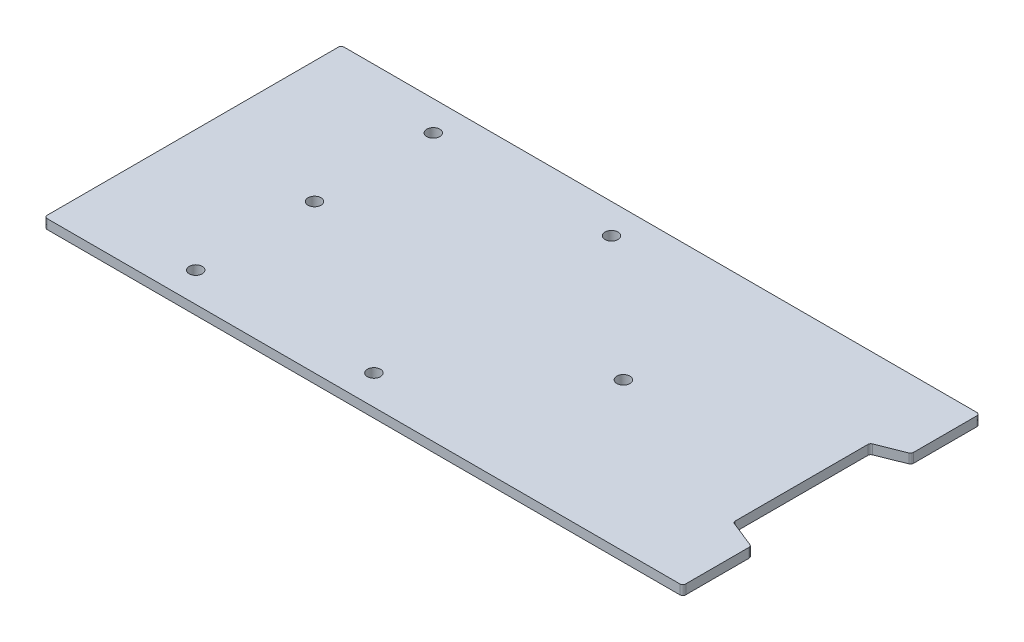
ISO-10303-21;
HEADER;
FILE_DESCRIPTION(('STEP AP214'),'2;1');
FILE_NAME('part.step','',(''),(''),'','','');
FILE_SCHEMA(('AUTOMOTIVE_DESIGN { 1 0 10303 214 1 1 1 1 }'));
ENDSEC;
DATA;
#1=APPLICATION_CONTEXT('core data for automotive mechanical design processes');
#2=APPLICATION_PROTOCOL_DEFINITION('international standard','automotive_design',2000,#1);
#3=PRODUCT_CONTEXT('',#1,'mechanical');
#4=PRODUCT('Part','Part','',(#3));
#5=PRODUCT_RELATED_PRODUCT_CATEGORY('part','',(#4));
#6=PRODUCT_DEFINITION_FORMATION('','',#4);
#7=PRODUCT_DEFINITION_CONTEXT('part definition',#1,'design');
#8=PRODUCT_DEFINITION('design','',#6,#7);
#9=PRODUCT_DEFINITION_SHAPE('','',#8);
#10=(LENGTH_UNIT() NAMED_UNIT(*) SI_UNIT(.MILLI.,.METRE.));
#11=(NAMED_UNIT(*) PLANE_ANGLE_UNIT() SI_UNIT($,.RADIAN.));
#12=(NAMED_UNIT(*) SI_UNIT($,.STERADIAN.) SOLID_ANGLE_UNIT());
#13=UNCERTAINTY_MEASURE_WITH_UNIT(LENGTH_MEASURE(1.E-05),#10,'distance_accuracy_value','');
#14=(GEOMETRIC_REPRESENTATION_CONTEXT(3) GLOBAL_UNCERTAINTY_ASSIGNED_CONTEXT((#13)) GLOBAL_UNIT_ASSIGNED_CONTEXT((#10,
#11,#12)) REPRESENTATION_CONTEXT('',''));
#15=CARTESIAN_POINT('',(0.,0.,0.));
#16=DIRECTION('',(0.,0.,1.));
#17=DIRECTION('',(1.,0.,0.));
#18=AXIS2_PLACEMENT_3D('',#15,#16,#17);
#19=CARTESIAN_POINT('',(0.507399766020101,1.6,-0.507399766020101));
#20=DIRECTION('',(0.,-1.,0.));
#21=DIRECTION('',(0.,0.,-1.));
#22=AXIS2_PLACEMENT_3D('',#19,#20,#21);
#23=CYLINDRICAL_SURFACE('',#22,0.507399766020101);
#24=CARTESIAN_POINT('',(0.507399766020101,0.,-0.507399766020101));
#25=DIRECTION('',(0.,-1.,0.));
#26=DIRECTION('',(0.,0.,-1.));
#27=AXIS2_PLACEMENT_3D('',#24,#25,#26);
#28=CIRCLE('',#27,0.507399766020101);
#29=CARTESIAN_POINT('',(0.507399766020104,0.,0.));
#30=VERTEX_POINT('',#29);
#31=CARTESIAN_POINT('',(0.,0.,-0.507399766020104));
#32=VERTEX_POINT('',#31);
#33=EDGE_CURVE('E179',#30,#32,#28,.T.);
#34=ORIENTED_EDGE('',*,*,#33,.F.);
#35=DIRECTION('',(0.,-1.,0.));
#36=VECTOR('',#35,1.);
#37=CARTESIAN_POINT('',(0.507399766020104,1.6,0.));
#38=LINE('',#37,#36);
#39=CARTESIAN_POINT('',(0.507399766020104,1.6,0.));
#40=VERTEX_POINT('',#39);
#41=EDGE_CURVE('E11',#40,#30,#38,.T.);
#42=ORIENTED_EDGE('',*,*,#41,.F.);
#43=CARTESIAN_POINT('',(0.507399766020101,1.6,-0.507399766020101));
#44=DIRECTION('',(0.,-1.,0.));
#45=DIRECTION('',(0.,0.,-1.));
#46=AXIS2_PLACEMENT_3D('',#43,#44,#45);
#47=CIRCLE('',#46,0.507399766020101);
#48=CARTESIAN_POINT('',(0.,1.6,-0.507399766020104));
#49=VERTEX_POINT('',#48);
#50=EDGE_CURVE('E220',#40,#49,#47,.T.);
#51=ORIENTED_EDGE('',*,*,#50,.T.);
#52=DIRECTION('',(0.,-1.,0.));
#53=VECTOR('',#52,1.);
#54=CARTESIAN_POINT('',(0.,1.6,-0.507399766020104));
#55=LINE('',#54,#53);
#56=EDGE_CURVE('E38',#49,#32,#55,.T.);
#57=ORIENTED_EDGE('',*,*,#56,.T.);
#58=EDGE_LOOP('',(#34,#42,#51,#57));
#59=FACE_BOUND('',#58,.T.);
#60=ADVANCED_FACE('F35',(#59),#23,.T.);
#61=CARTESIAN_POINT('',(0.507399766020104,1.6,0.));
#62=DIRECTION('',(0.,0.,-1.));
#63=DIRECTION('',(-1.,0.,0.));
#64=AXIS2_PLACEMENT_3D('',#61,#62,#63);
#65=PLANE('',#64);
#66=DIRECTION('',(1.,0.,0.));
#67=VECTOR('',#66,1.);
#68=CARTESIAN_POINT('',(0.507399766020104,0.,0.));
#69=LINE('',#68,#67);
#70=CARTESIAN_POINT('',(106.99260023398,0.,0.));
#71=VERTEX_POINT('',#70);
#72=EDGE_CURVE('E102',#30,#71,#69,.T.);
#73=ORIENTED_EDGE('',*,*,#72,.T.);
#74=DIRECTION('',(0.,-1.,0.));
#75=VECTOR('',#74,1.);
#76=CARTESIAN_POINT('',(106.99260023398,1.6,0.));
#77=LINE('',#76,#75);
#78=CARTESIAN_POINT('',(106.99260023398,1.6,0.));
#79=VERTEX_POINT('',#78);
#80=EDGE_CURVE('E44',#79,#71,#77,.T.);
#81=ORIENTED_EDGE('',*,*,#80,.F.);
#82=DIRECTION('',(1.,0.,0.));
#83=VECTOR('',#82,1.);
#84=CARTESIAN_POINT('',(102.5,1.6,0.));
#85=LINE('',#84,#83);
#86=EDGE_CURVE('E52',#40,#79,#85,.T.);
#87=ORIENTED_EDGE('',*,*,#86,.F.);
#88=ORIENTED_EDGE('',*,*,#41,.T.);
#89=EDGE_LOOP('',(#73,#81,#87,#88));
#90=FACE_BOUND('',#89,.T.);
#91=ADVANCED_FACE('F369',(#90),#65,.F.);
#92=CARTESIAN_POINT('',(106.99260023398,1.6,-0.507399766020101));
#93=DIRECTION('',(0.,-1.,0.));
#94=DIRECTION('',(0.,0.,-1.));
#95=AXIS2_PLACEMENT_3D('',#92,#93,#94);
#96=CYLINDRICAL_SURFACE('',#95,0.507399766020101);
#97=CARTESIAN_POINT('',(106.99260023398,0.,-0.507399766020101));
#98=DIRECTION('',(0.,1.,0.));
#99=DIRECTION('',(0.,0.,1.));
#100=AXIS2_PLACEMENT_3D('',#97,#98,#99);
#101=CIRCLE('',#100,0.507399766020101);
#102=CARTESIAN_POINT('',(107.5,0.,-0.507399766020105));
#103=VERTEX_POINT('',#102);
#104=EDGE_CURVE('E164',#71,#103,#101,.T.);
#105=ORIENTED_EDGE('',*,*,#104,.T.);
#106=DIRECTION('',(0.,-1.,0.));
#107=VECTOR('',#106,1.);
#108=CARTESIAN_POINT('',(107.5,1.6,-0.507399766020105));
#109=LINE('',#108,#107);
#110=CARTESIAN_POINT('',(107.5,1.6,-0.507399766020105));
#111=VERTEX_POINT('',#110);
#112=EDGE_CURVE('E161',#111,#103,#109,.T.);
#113=ORIENTED_EDGE('',*,*,#112,.F.);
#114=CARTESIAN_POINT('',(106.99260023398,1.6,-0.507399766020101));
#115=DIRECTION('',(0.,1.,0.));
#116=DIRECTION('',(0.,0.,1.));
#117=AXIS2_PLACEMENT_3D('',#114,#115,#116);
#118=CIRCLE('',#117,0.507399766020101);
#119=EDGE_CURVE('E150',#79,#111,#118,.T.);
#120=ORIENTED_EDGE('',*,*,#119,.F.);
#121=ORIENTED_EDGE('',*,*,#80,.T.);
#122=EDGE_LOOP('',(#105,#113,#120,#121));
#123=FACE_BOUND('',#122,.T.);
#124=ADVANCED_FACE('F162',(#123),#96,.T.);
#125=CARTESIAN_POINT('',(107.5,1.6,-0.507399766020105));
#126=DIRECTION('',(-1.,0.,0.));
#127=DIRECTION('',(0.,0.,1.));
#128=AXIS2_PLACEMENT_3D('',#125,#126,#127);
#129=PLANE('',#128);
#130=DIRECTION('',(0.,0.,-1.));
#131=VECTOR('',#130,1.);
#132=CARTESIAN_POINT('',(107.5,0.,-0.507399766020105));
#133=LINE('',#132,#131);
#134=CARTESIAN_POINT('',(107.5,0.,-11.1564736337841));
#135=VERTEX_POINT('',#134);
#136=EDGE_CURVE('E217',#103,#135,#133,.T.);
#137=ORIENTED_EDGE('',*,*,#136,.T.);
#138=DIRECTION('',(0.,-1.,0.));
#139=VECTOR('',#138,1.);
#140=CARTESIAN_POINT('',(107.5,1.6,-11.1564736337841));
#141=LINE('',#140,#139);
#142=CARTESIAN_POINT('',(107.5,1.6,-11.1564736337841));
#143=VERTEX_POINT('',#142);
#144=EDGE_CURVE('E168',#143,#135,#141,.T.);
#145=ORIENTED_EDGE('',*,*,#144,.F.);
#146=DIRECTION('',(0.,0.,-1.));
#147=VECTOR('',#146,1.);
#148=CARTESIAN_POINT('',(107.5,1.6,-0.507399766020105));
#149=LINE('',#148,#147);
#150=EDGE_CURVE('E156',#111,#143,#149,.T.);
#151=ORIENTED_EDGE('',*,*,#150,.F.);
#152=ORIENTED_EDGE('',*,*,#112,.T.);
#153=EDGE_LOOP('',(#137,#145,#151,#152));
#154=FACE_BOUND('',#153,.T.);
#155=ADVANCED_FACE('F170',(#154),#129,.F.);
#156=CARTESIAN_POINT('',(106.99260023398,1.6,-11.1564736337841));
#157=DIRECTION('',(0.,-1.,0.));
#158=DIRECTION('',(0.,0.,-1.));
#159=AXIS2_PLACEMENT_3D('',#156,#157,#158);
#160=CYLINDRICAL_SURFACE('',#159,0.507399766020101);
#161=CARTESIAN_POINT('',(106.99260023398,0.,-11.1564736337841));
#162=DIRECTION('',(0.,-1.,0.));
#163=DIRECTION('',(0.,0.,-1.));
#164=AXIS2_PLACEMENT_3D('',#161,#162,#163);
#165=CIRCLE('',#164,0.507399766020101);
#166=CARTESIAN_POINT('',(107.181043776264,0.,-11.6275824894944));
#167=VERTEX_POINT('',#166);
#168=EDGE_CURVE('E214',#167,#135,#165,.T.);
#169=ORIENTED_EDGE('',*,*,#168,.F.);
#170=DIRECTION('',(0.,-1.,0.));
#171=VECTOR('',#170,1.);
#172=CARTESIAN_POINT('',(107.181043776264,1.6,-11.6275824894944));
#173=LINE('',#172,#171);
#174=CARTESIAN_POINT('',(107.181043776264,1.6,-11.6275824894944));
#175=VERTEX_POINT('',#174);
#176=EDGE_CURVE('E224',#175,#167,#173,.T.);
#177=ORIENTED_EDGE('',*,*,#176,.F.);
#178=CARTESIAN_POINT('',(106.99260023398,1.6,-11.1564736337841));
#179=DIRECTION('',(0.,-1.,0.));
#180=DIRECTION('',(0.,0.,-1.));
#181=AXIS2_PLACEMENT_3D('',#178,#179,#180);
#182=CIRCLE('',#181,0.507399766020101);
#183=EDGE_CURVE('E172',#175,#143,#182,.T.);
#184=ORIENTED_EDGE('',*,*,#183,.T.);
#185=ORIENTED_EDGE('',*,*,#144,.T.);
#186=EDGE_LOOP('',(#169,#177,#184,#185));
#187=FACE_BOUND('',#186,.T.);
#188=ADVANCED_FACE('F258',(#187),#160,.T.);
#189=CARTESIAN_POINT('',(107.181043776264,1.6,-11.6275824894944));
#190=DIRECTION('',(-0.371390676354104,0.,0.928476690885259));
#191=DIRECTION('',(0.928476690885259,0.,0.371390676354104));
#192=AXIS2_PLACEMENT_3D('',#189,#190,#191);
#193=PLANE('',#192);
#194=DIRECTION('',(-0.928476690885259,0.,-0.371390676354105));
#195=VECTOR('',#194,1.);
#196=CARTESIAN_POINT('',(107.181043776264,0.,-11.6275824894944));
#197=LINE('',#196,#195);
#198=CARTESIAN_POINT('',(102.818956223736,0.,-13.3724175105056));
#199=VERTEX_POINT('',#198);
#200=EDGE_CURVE('E212',#167,#199,#197,.T.);
#201=ORIENTED_EDGE('',*,*,#200,.T.);
#202=DIRECTION('',(0.,-1.,0.));
#203=VECTOR('',#202,1.);
#204=CARTESIAN_POINT('',(102.818956223736,1.6,-13.3724175105056));
#205=LINE('',#204,#203);
#206=CARTESIAN_POINT('',(102.818956223736,1.6,-13.3724175105056));
#207=VERTEX_POINT('',#206);
#208=EDGE_CURVE('E226',#207,#199,#205,.T.);
#209=ORIENTED_EDGE('',*,*,#208,.F.);
#210=DIRECTION('',(-0.928476690885259,0.,-0.371390676354105));
#211=VECTOR('',#210,1.);
#212=CARTESIAN_POINT('',(107.181043776264,1.6,-11.6275824894944));
#213=LINE('',#212,#211);
#214=EDGE_CURVE('E174',#175,#207,#213,.T.);
#215=ORIENTED_EDGE('',*,*,#214,.F.);
#216=ORIENTED_EDGE('',*,*,#176,.T.);
#217=EDGE_LOOP('',(#201,#209,#215,#216));
#218=FACE_BOUND('',#217,.T.);
#219=ADVANCED_FACE('F265',(#218),#193,.F.);
#220=CARTESIAN_POINT('',(103.00739976602,1.6,-13.8435263662159));
#221=DIRECTION('',(0.,-1.,0.));
#222=DIRECTION('',(0.,0.,-1.));
#223=AXIS2_PLACEMENT_3D('',#220,#221,#222);
#224=CYLINDRICAL_SURFACE('',#223,0.507399766020101);
#225=CARTESIAN_POINT('',(103.00739976602,0.,-13.8435263662159));
#226=DIRECTION('',(0.,-1.,0.));
#227=DIRECTION('',(0.,0.,-1.));
#228=AXIS2_PLACEMENT_3D('',#225,#226,#227);
#229=CIRCLE('',#228,0.507399766020101);
#230=CARTESIAN_POINT('',(102.5,0.,-13.8435263662159));
#231=VERTEX_POINT('',#230);
#232=EDGE_CURVE('E210',#199,#231,#229,.T.);
#233=ORIENTED_EDGE('',*,*,#232,.T.);
#234=DIRECTION('',(0.,-1.,0.));
#235=VECTOR('',#234,1.);
#236=CARTESIAN_POINT('',(102.5,1.6,-13.8435263662159));
#237=LINE('',#236,#235);
#238=CARTESIAN_POINT('',(102.5,1.6,-13.8435263662159));
#239=VERTEX_POINT('',#238);
#240=EDGE_CURVE('E229',#239,#231,#237,.T.);
#241=ORIENTED_EDGE('',*,*,#240,.F.);
#242=CARTESIAN_POINT('',(103.00739976602,1.6,-13.8435263662159));
#243=DIRECTION('',(0.,-1.,0.));
#244=DIRECTION('',(0.,0.,-1.));
#245=AXIS2_PLACEMENT_3D('',#242,#243,#244);
#246=CIRCLE('',#245,0.507399766020101);
#247=EDGE_CURVE('E262',#207,#239,#246,.T.);
#248=ORIENTED_EDGE('',*,*,#247,.F.);
#249=ORIENTED_EDGE('',*,*,#208,.T.);
#250=EDGE_LOOP('',(#233,#241,#248,#249));
#251=FACE_BOUND('',#250,.T.);
#252=ADVANCED_FACE('F267',(#251),#224,.F.);
#253=CARTESIAN_POINT('',(102.5,1.6,-13.8435263662159));
#254=DIRECTION('',(-1.,0.,0.));
#255=DIRECTION('',(0.,0.,1.));
#256=AXIS2_PLACEMENT_3D('',#253,#254,#255);
#257=PLANE('',#256);
#258=DIRECTION('',(0.,0.,-1.));
#259=VECTOR('',#258,1.);
#260=CARTESIAN_POINT('',(102.5,0.,-13.8435263662159));
#261=LINE('',#260,#259);
#262=CARTESIAN_POINT('',(102.5,0.,-36.1564736337841));
#263=VERTEX_POINT('',#262);
#264=EDGE_CURVE('E207',#231,#263,#261,.T.);
#265=ORIENTED_EDGE('',*,*,#264,.T.);
#266=DIRECTION('',(0.,-1.,0.));
#267=VECTOR('',#266,1.);
#268=CARTESIAN_POINT('',(102.5,1.6,-36.1564736337841));
#269=LINE('',#268,#267);
#270=CARTESIAN_POINT('',(102.5,1.6,-36.1564736337841));
#271=VERTEX_POINT('',#270);
#272=EDGE_CURVE('E232',#271,#263,#269,.T.);
#273=ORIENTED_EDGE('',*,*,#272,.F.);
#274=DIRECTION('',(0.,0.,-1.));
#275=VECTOR('',#274,1.);
#276=CARTESIAN_POINT('',(102.5,1.6,-13.8435263662159));
#277=LINE('',#276,#275);
#278=EDGE_CURVE('E269',#239,#271,#277,.T.);
#279=ORIENTED_EDGE('',*,*,#278,.F.);
#280=ORIENTED_EDGE('',*,*,#240,.T.);
#281=EDGE_LOOP('',(#265,#273,#279,#280));
#282=FACE_BOUND('',#281,.T.);
#283=ADVANCED_FACE('F387',(#282),#257,.F.);
#284=CARTESIAN_POINT('',(103.00739976602,1.6,-36.1564736337841));
#285=DIRECTION('',(0.,-1.,0.));
#286=DIRECTION('',(0.,0.,-1.));
#287=AXIS2_PLACEMENT_3D('',#284,#285,#286);
#288=CYLINDRICAL_SURFACE('',#287,0.507399766020101);
#289=CARTESIAN_POINT('',(103.00739976602,0.,-36.1564736337841));
#290=DIRECTION('',(0.,1.,0.));
#291=DIRECTION('',(0.,0.,1.));
#292=AXIS2_PLACEMENT_3D('',#289,#290,#291);
#293=CIRCLE('',#292,0.507399766020101);
#294=CARTESIAN_POINT('',(102.818956223736,0.,-36.6275824894944));
#295=VERTEX_POINT('',#294);
#296=EDGE_CURVE('E204',#295,#263,#293,.T.);
#297=ORIENTED_EDGE('',*,*,#296,.F.);
#298=DIRECTION('',(0.,-1.,0.));
#299=VECTOR('',#298,1.);
#300=CARTESIAN_POINT('',(102.818956223736,1.6,-36.6275824894944));
#301=LINE('',#300,#299);
#302=CARTESIAN_POINT('',(102.818956223736,1.6,-36.6275824894944));
#303=VERTEX_POINT('',#302);
#304=EDGE_CURVE('E234',#303,#295,#301,.T.);
#305=ORIENTED_EDGE('',*,*,#304,.F.);
#306=CARTESIAN_POINT('',(103.00739976602,1.6,-36.1564736337841));
#307=DIRECTION('',(0.,1.,0.));
#308=DIRECTION('',(0.,0.,1.));
#309=AXIS2_PLACEMENT_3D('',#306,#307,#308);
#310=CIRCLE('',#309,0.507399766020101);
#311=EDGE_CURVE('E271',#303,#271,#310,.T.);
#312=ORIENTED_EDGE('',*,*,#311,.T.);
#313=ORIENTED_EDGE('',*,*,#272,.T.);
#314=EDGE_LOOP('',(#297,#305,#312,#313));
#315=FACE_BOUND('',#314,.T.);
#316=ADVANCED_FACE('F390',(#315),#288,.F.);
#317=CARTESIAN_POINT('',(107.181043776264,1.6,-38.3724175105056));
#318=DIRECTION('',(0.371390676354106,0.,0.928476690885258));
#319=DIRECTION('',(0.928476690885259,0.,-0.371390676354106));
#320=AXIS2_PLACEMENT_3D('',#317,#318,#319);
#321=PLANE('',#320);
#322=DIRECTION('',(-0.928476690885259,0.,0.371390676354106));
#323=VECTOR('',#322,1.);
#324=CARTESIAN_POINT('',(107.181043776264,0.,-38.3724175105056));
#325=LINE('',#324,#323);
#326=CARTESIAN_POINT('',(107.181043776264,0.,-38.3724175105056));
#327=VERTEX_POINT('',#326);
#328=EDGE_CURVE('E201',#327,#295,#325,.T.);
#329=ORIENTED_EDGE('',*,*,#328,.F.);
#330=DIRECTION('',(0.,-1.,0.));
#331=VECTOR('',#330,1.);
#332=CARTESIAN_POINT('',(107.181043776264,1.6,-38.3724175105056));
#333=LINE('',#332,#331);
#334=CARTESIAN_POINT('',(107.181043776264,1.6,-38.3724175105056));
#335=VERTEX_POINT('',#334);
#336=EDGE_CURVE('E236',#335,#327,#333,.T.);
#337=ORIENTED_EDGE('',*,*,#336,.F.);
#338=DIRECTION('',(-0.928476690885259,0.,0.371390676354106));
#339=VECTOR('',#338,1.);
#340=CARTESIAN_POINT('',(107.181043776264,1.6,-38.3724175105056));
#341=LINE('',#340,#339);
#342=EDGE_CURVE('E276',#335,#303,#341,.T.);
#343=ORIENTED_EDGE('',*,*,#342,.T.);
#344=ORIENTED_EDGE('',*,*,#304,.T.);
#345=EDGE_LOOP('',(#329,#337,#343,#344));
#346=FACE_BOUND('',#345,.T.);
#347=ADVANCED_FACE('F394',(#346),#321,.T.);
#348=CARTESIAN_POINT('',(106.99260023398,1.6,-38.8435263662159));
#349=DIRECTION('',(0.,-1.,0.));
#350=DIRECTION('',(0.,0.,-1.));
#351=AXIS2_PLACEMENT_3D('',#348,#349,#350);
#352=CYLINDRICAL_SURFACE('',#351,0.507399766020101);
#353=CARTESIAN_POINT('',(106.99260023398,0.,-38.8435263662159));
#354=DIRECTION('',(0.,-1.,0.));
#355=DIRECTION('',(0.,0.,-1.));
#356=AXIS2_PLACEMENT_3D('',#353,#354,#355);
#357=CIRCLE('',#356,0.507399766020101);
#358=CARTESIAN_POINT('',(107.5,0.,-38.8435263662159));
#359=VERTEX_POINT('',#358);
#360=EDGE_CURVE('E198',#359,#327,#357,.T.);
#361=ORIENTED_EDGE('',*,*,#360,.F.);
#362=DIRECTION('',(0.,-1.,0.));
#363=VECTOR('',#362,1.);
#364=CARTESIAN_POINT('',(107.5,1.6,-38.8435263662159));
#365=LINE('',#364,#363);
#366=CARTESIAN_POINT('',(107.5,1.6,-38.8435263662159));
#367=VERTEX_POINT('',#366);
#368=EDGE_CURVE('E238',#367,#359,#365,.T.);
#369=ORIENTED_EDGE('',*,*,#368,.F.);
#370=CARTESIAN_POINT('',(106.99260023398,1.6,-38.8435263662159));
#371=DIRECTION('',(0.,-1.,0.));
#372=DIRECTION('',(0.,0.,-1.));
#373=AXIS2_PLACEMENT_3D('',#370,#371,#372);
#374=CIRCLE('',#373,0.507399766020101);
#375=EDGE_CURVE('E279',#367,#335,#374,.T.);
#376=ORIENTED_EDGE('',*,*,#375,.T.);
#377=ORIENTED_EDGE('',*,*,#336,.T.);
#378=EDGE_LOOP('',(#361,#369,#376,#377));
#379=FACE_BOUND('',#378,.T.);
#380=ADVANCED_FACE('F398',(#379),#352,.T.);
#381=CARTESIAN_POINT('',(107.5,1.6,-49.4926002339799));
#382=DIRECTION('',(1.,0.,0.));
#383=DIRECTION('',(0.,0.,-1.));
#384=AXIS2_PLACEMENT_3D('',#381,#382,#383);
#385=PLANE('',#384);
#386=DIRECTION('',(0.,0.,1.));
#387=VECTOR('',#386,1.);
#388=CARTESIAN_POINT('',(107.5,0.,-49.4926002339799));
#389=LINE('',#388,#387);
#390=CARTESIAN_POINT('',(107.5,0.,-49.4926002339799));
#391=VERTEX_POINT('',#390);
#392=EDGE_CURVE('E195',#391,#359,#389,.T.);
#393=ORIENTED_EDGE('',*,*,#392,.F.);
#394=DIRECTION('',(0.,-1.,0.));
#395=VECTOR('',#394,1.);
#396=CARTESIAN_POINT('',(107.5,1.6,-49.4926002339799));
#397=LINE('',#396,#395);
#398=CARTESIAN_POINT('',(107.5,1.6,-49.4926002339799));
#399=VERTEX_POINT('',#398);
#400=EDGE_CURVE('E240',#399,#391,#397,.T.);
#401=ORIENTED_EDGE('',*,*,#400,.F.);
#402=DIRECTION('',(0.,0.,1.));
#403=VECTOR('',#402,1.);
#404=CARTESIAN_POINT('',(107.5,1.6,-49.4926002339799));
#405=LINE('',#404,#403);
#406=EDGE_CURVE('E282',#399,#367,#405,.T.);
#407=ORIENTED_EDGE('',*,*,#406,.T.);
#408=ORIENTED_EDGE('',*,*,#368,.T.);
#409=EDGE_LOOP('',(#393,#401,#407,#408));
#410=FACE_BOUND('',#409,.T.);
#411=ADVANCED_FACE('F402',(#410),#385,.T.);
#412=CARTESIAN_POINT('',(106.99260023398,1.6,-49.4926002339799));
#413=DIRECTION('',(0.,-1.,0.));
#414=DIRECTION('',(0.,0.,-1.));
#415=AXIS2_PLACEMENT_3D('',#412,#413,#414);
#416=CYLINDRICAL_SURFACE('',#415,0.5073997660201);
#417=CARTESIAN_POINT('',(106.99260023398,0.,-49.4926002339799));
#418=DIRECTION('',(0.,-1.,0.));
#419=DIRECTION('',(0.,0.,-1.));
#420=AXIS2_PLACEMENT_3D('',#417,#418,#419);
#421=CIRCLE('',#420,0.5073997660201);
#422=CARTESIAN_POINT('',(106.99260023398,0.,-50.));
#423=VERTEX_POINT('',#422);
#424=EDGE_CURVE('E192',#423,#391,#421,.T.);
#425=ORIENTED_EDGE('',*,*,#424,.F.);
#426=DIRECTION('',(0.,-1.,0.));
#427=VECTOR('',#426,1.);
#428=CARTESIAN_POINT('',(106.99260023398,1.6,-50.));
#429=LINE('',#428,#427);
#430=CARTESIAN_POINT('',(106.99260023398,1.6,-50.));
#431=VERTEX_POINT('',#430);
#432=EDGE_CURVE('E242',#431,#423,#429,.T.);
#433=ORIENTED_EDGE('',*,*,#432,.F.);
#434=CARTESIAN_POINT('',(106.99260023398,1.6,-49.4926002339799));
#435=DIRECTION('',(0.,-1.,0.));
#436=DIRECTION('',(0.,0.,-1.));
#437=AXIS2_PLACEMENT_3D('',#434,#435,#436);
#438=CIRCLE('',#437,0.5073997660201);
#439=EDGE_CURVE('E285',#431,#399,#438,.T.);
#440=ORIENTED_EDGE('',*,*,#439,.T.);
#441=ORIENTED_EDGE('',*,*,#400,.T.);
#442=EDGE_LOOP('',(#425,#433,#440,#441));
#443=FACE_BOUND('',#442,.T.);
#444=ADVANCED_FACE('F406',(#443),#416,.T.);
#445=CARTESIAN_POINT('',(102.5,1.6,-50.));
#446=DIRECTION('',(0.,0.,-1.));
#447=DIRECTION('',(-1.,0.,0.));
#448=AXIS2_PLACEMENT_3D('',#445,#446,#447);
#449=PLANE('',#448);
#450=DIRECTION('',(1.,0.,0.));
#451=VECTOR('',#450,1.);
#452=CARTESIAN_POINT('',(102.5,0.,-50.));
#453=LINE('',#452,#451);
#454=CARTESIAN_POINT('',(0.507399766020063,0.,-50.));
#455=VERTEX_POINT('',#454);
#456=EDGE_CURVE('E189',#455,#423,#453,.T.);
#457=ORIENTED_EDGE('',*,*,#456,.F.);
#458=DIRECTION('',(0.,-1.,0.));
#459=VECTOR('',#458,1.);
#460=CARTESIAN_POINT('',(0.507399766020063,1.6,-50.));
#461=LINE('',#460,#459);
#462=CARTESIAN_POINT('',(0.507399766020063,1.6,-50.));
#463=VERTEX_POINT('',#462);
#464=EDGE_CURVE('E244',#463,#455,#461,.T.);
#465=ORIENTED_EDGE('',*,*,#464,.F.);
#466=DIRECTION('',(1.,0.,0.));
#467=VECTOR('',#466,1.);
#468=CARTESIAN_POINT('',(0.507399766020063,1.6,-50.));
#469=LINE('',#468,#467);
#470=EDGE_CURVE('E288',#463,#431,#469,.T.);
#471=ORIENTED_EDGE('',*,*,#470,.T.);
#472=ORIENTED_EDGE('',*,*,#432,.T.);
#473=EDGE_LOOP('',(#457,#465,#471,#472));
#474=FACE_BOUND('',#473,.T.);
#475=ADVANCED_FACE('F410',(#474),#449,.T.);
#476=CARTESIAN_POINT('',(0.50739976602006,1.6,-49.4926002339799));
#477=DIRECTION('',(0.,-1.,0.));
#478=DIRECTION('',(0.,0.,-1.));
#479=AXIS2_PLACEMENT_3D('',#476,#477,#478);
#480=CYLINDRICAL_SURFACE('',#479,0.507399766020101);
#481=CARTESIAN_POINT('',(0.50739976602006,0.,-49.4926002339799));
#482=DIRECTION('',(0.,-1.,0.));
#483=DIRECTION('',(0.,0.,-1.));
#484=AXIS2_PLACEMENT_3D('',#481,#482,#483);
#485=CIRCLE('',#484,0.507399766020101);
#486=CARTESIAN_POINT('',(0.,0.,-49.4926002339799));
#487=VERTEX_POINT('',#486);
#488=EDGE_CURVE('E186',#487,#455,#485,.T.);
#489=ORIENTED_EDGE('',*,*,#488,.F.);
#490=DIRECTION('',(0.,-1.,0.));
#491=VECTOR('',#490,1.);
#492=CARTESIAN_POINT('',(0.,1.6,-49.4926002339799));
#493=LINE('',#492,#491);
#494=CARTESIAN_POINT('',(0.,1.6,-49.4926002339799));
#495=VERTEX_POINT('',#494);
#496=EDGE_CURVE('E246',#495,#487,#493,.T.);
#497=ORIENTED_EDGE('',*,*,#496,.F.);
#498=CARTESIAN_POINT('',(0.50739976602006,1.6,-49.4926002339799));
#499=DIRECTION('',(0.,-1.,0.));
#500=DIRECTION('',(0.,0.,-1.));
#501=AXIS2_PLACEMENT_3D('',#498,#499,#500);
#502=CIRCLE('',#501,0.507399766020101);
#503=EDGE_CURVE('E290',#495,#463,#502,.T.);
#504=ORIENTED_EDGE('',*,*,#503,.T.);
#505=ORIENTED_EDGE('',*,*,#464,.T.);
#506=EDGE_LOOP('',(#489,#497,#504,#505));
#507=FACE_BOUND('',#506,.T.);
#508=ADVANCED_FACE('F414',(#507),#480,.T.);
#509=CARTESIAN_POINT('',(0.,1.6,-0.507399766020104));
#510=DIRECTION('',(-1.,0.,0.));
#511=DIRECTION('',(0.,0.,1.));
#512=AXIS2_PLACEMENT_3D('',#509,#510,#511);
#513=PLANE('',#512);
#514=DIRECTION('',(0.,0.,-1.));
#515=VECTOR('',#514,1.);
#516=CARTESIAN_POINT('',(0.,0.,-0.507399766020104));
#517=LINE('',#516,#515);
#518=EDGE_CURVE('E182',#32,#487,#517,.T.);
#519=ORIENTED_EDGE('',*,*,#518,.F.);
#520=ORIENTED_EDGE('',*,*,#56,.F.);
#521=DIRECTION('',(0.,0.,-1.));
#522=VECTOR('',#521,1.);
#523=CARTESIAN_POINT('',(0.,1.6,-0.507399766020104));
#524=LINE('',#523,#522);
#525=EDGE_CURVE('E293',#49,#495,#524,.T.);
#526=ORIENTED_EDGE('',*,*,#525,.T.);
#527=ORIENTED_EDGE('',*,*,#496,.T.);
#528=EDGE_LOOP('',(#519,#520,#526,#527));
#529=FACE_BOUND('',#528,.T.);
#530=ADVANCED_FACE('F251',(#529),#513,.T.);
#531=CARTESIAN_POINT('',(0.507399766020101,1.6,-0.507399766020101));
#532=DIRECTION('',(0.,-1.,0.));
#533=DIRECTION('',(0.,0.,-1.));
#534=AXIS2_PLACEMENT_3D('',#531,#532,#533);
#535=PLANE('',#534);
#536=CARTESIAN_POINT('',(72.5,1.6,-25.));
#537=DIRECTION('',(0.,1.,0.));
#538=DIRECTION('',(0.,0.,1.));
#539=AXIS2_PLACEMENT_3D('',#536,#537,#538);
#540=CIRCLE('',#539,1.09999999999999);
#541=CARTESIAN_POINT('',(72.5,1.6,-23.9));
#542=VERTEX_POINT('',#541);
#543=EDGE_CURVE('E326',#542,#542,#540,.T.);
#544=ORIENTED_EDGE('',*,*,#543,.F.);
#545=EDGE_LOOP('',(#544));
#546=FACE_BOUND('',#545,.T.);
#547=CARTESIAN_POINT('',(50.5,1.6,-5.));
#548=DIRECTION('',(0.,1.,0.));
#549=DIRECTION('',(0.,0.,1.));
#550=AXIS2_PLACEMENT_3D('',#547,#548,#549);
#551=CIRCLE('',#550,1.1);
#552=CARTESIAN_POINT('',(50.5,1.6,-3.9));
#553=VERTEX_POINT('',#552);
#554=EDGE_CURVE('E320',#553,#553,#551,.T.);
#555=ORIENTED_EDGE('',*,*,#554,.F.);
#556=EDGE_LOOP('',(#555));
#557=FACE_BOUND('',#556,.T.);
#558=CARTESIAN_POINT('',(50.5,1.6,-45.));
#559=DIRECTION('',(0.,1.,0.));
#560=DIRECTION('',(0.,0.,1.));
#561=AXIS2_PLACEMENT_3D('',#558,#559,#560);
#562=CIRCLE('',#561,1.1);
#563=CARTESIAN_POINT('',(50.5,1.6,-43.9));
#564=VERTEX_POINT('',#563);
#565=EDGE_CURVE('E314',#564,#564,#562,.T.);
#566=ORIENTED_EDGE('',*,*,#565,.F.);
#567=EDGE_LOOP('',(#566));
#568=FACE_BOUND('',#567,.T.);
#569=CARTESIAN_POINT('',(20.5,1.6,-45.));
#570=DIRECTION('',(0.,1.,0.));
#571=DIRECTION('',(0.,0.,1.));
#572=AXIS2_PLACEMENT_3D('',#569,#570,#571);
#573=CIRCLE('',#572,1.09999999999999);
#574=CARTESIAN_POINT('',(20.5,1.6,-43.9));
#575=VERTEX_POINT('',#574);
#576=EDGE_CURVE('E308',#575,#575,#573,.T.);
#577=ORIENTED_EDGE('',*,*,#576,.F.);
#578=EDGE_LOOP('',(#577));
#579=FACE_BOUND('',#578,.T.);
#580=CARTESIAN_POINT('',(20.5,1.6,-25.));
#581=DIRECTION('',(0.,1.,0.));
#582=DIRECTION('',(0.,0.,1.));
#583=AXIS2_PLACEMENT_3D('',#580,#581,#582);
#584=CIRCLE('',#583,1.1);
#585=CARTESIAN_POINT('',(20.5,1.6,-23.9));
#586=VERTEX_POINT('',#585);
#587=EDGE_CURVE('E302',#586,#586,#584,.T.);
#588=ORIENTED_EDGE('',*,*,#587,.F.);
#589=EDGE_LOOP('',(#588));
#590=FACE_BOUND('',#589,.T.);
#591=CARTESIAN_POINT('',(20.5,1.6,-5.));
#592=DIRECTION('',(0.,1.,0.));
#593=DIRECTION('',(0.,0.,1.));
#594=AXIS2_PLACEMENT_3D('',#591,#592,#593);
#595=CIRCLE('',#594,1.1);
#596=CARTESIAN_POINT('',(20.5,1.6,-3.9));
#597=VERTEX_POINT('',#596);
#598=EDGE_CURVE('E296',#597,#597,#595,.T.);
#599=ORIENTED_EDGE('',*,*,#598,.F.);
#600=EDGE_LOOP('',(#599));
#601=FACE_BOUND('',#600,.T.);
#602=ORIENTED_EDGE('',*,*,#50,.F.);
#603=ORIENTED_EDGE('',*,*,#86,.T.);
#604=ORIENTED_EDGE('',*,*,#119,.T.);
#605=ORIENTED_EDGE('',*,*,#150,.T.);
#606=ORIENTED_EDGE('',*,*,#183,.F.);
#607=ORIENTED_EDGE('',*,*,#214,.T.);
#608=ORIENTED_EDGE('',*,*,#247,.T.);
#609=ORIENTED_EDGE('',*,*,#278,.T.);
#610=ORIENTED_EDGE('',*,*,#311,.F.);
#611=ORIENTED_EDGE('',*,*,#342,.F.);
#612=ORIENTED_EDGE('',*,*,#375,.F.);
#613=ORIENTED_EDGE('',*,*,#406,.F.);
#614=ORIENTED_EDGE('',*,*,#439,.F.);
#615=ORIENTED_EDGE('',*,*,#470,.F.);
#616=ORIENTED_EDGE('',*,*,#503,.F.);
#617=ORIENTED_EDGE('',*,*,#525,.F.);
#618=EDGE_LOOP('',(#602,#603,#604,#605,#606,#607,#608,#609,#610,#611,#612,#613,#614,#615,#616,#617));
#619=FACE_BOUND('',#618,.T.);
#620=ADVANCED_FACE('F153',(#546,#557,#568,#579,#590,#601,#619),#535,.F.);
#621=CARTESIAN_POINT('',(0.507399766020101,0.,-0.507399766020101));
#622=DIRECTION('',(0.,-1.,0.));
#623=DIRECTION('',(0.,0.,-1.));
#624=AXIS2_PLACEMENT_3D('',#621,#622,#623);
#625=PLANE('',#624);
#626=CARTESIAN_POINT('',(72.5,0.,-25.));
#627=DIRECTION('',(0.,1.,0.));
#628=DIRECTION('',(0.,0.,1.));
#629=AXIS2_PLACEMENT_3D('',#626,#627,#628);
#630=CIRCLE('',#629,1.09999999999999);
#631=CARTESIAN_POINT('',(72.5,0.,-23.9));
#632=VERTEX_POINT('',#631);
#633=EDGE_CURVE('E323',#632,#632,#630,.T.);
#634=ORIENTED_EDGE('',*,*,#633,.T.);
#635=EDGE_LOOP('',(#634));
#636=FACE_BOUND('',#635,.T.);
#637=CARTESIAN_POINT('',(50.5,0.,-5.));
#638=DIRECTION('',(0.,1.,0.));
#639=DIRECTION('',(0.,0.,1.));
#640=AXIS2_PLACEMENT_3D('',#637,#638,#639);
#641=CIRCLE('',#640,1.1);
#642=CARTESIAN_POINT('',(50.5,0.,-3.9));
#643=VERTEX_POINT('',#642);
#644=EDGE_CURVE('E317',#643,#643,#641,.T.);
#645=ORIENTED_EDGE('',*,*,#644,.T.);
#646=EDGE_LOOP('',(#645));
#647=FACE_BOUND('',#646,.T.);
#648=CARTESIAN_POINT('',(50.5,0.,-45.));
#649=DIRECTION('',(0.,1.,0.));
#650=DIRECTION('',(0.,0.,1.));
#651=AXIS2_PLACEMENT_3D('',#648,#649,#650);
#652=CIRCLE('',#651,1.1);
#653=CARTESIAN_POINT('',(50.5,0.,-43.9));
#654=VERTEX_POINT('',#653);
#655=EDGE_CURVE('E311',#654,#654,#652,.T.);
#656=ORIENTED_EDGE('',*,*,#655,.T.);
#657=EDGE_LOOP('',(#656));
#658=FACE_BOUND('',#657,.T.);
#659=CARTESIAN_POINT('',(20.5,0.,-45.));
#660=DIRECTION('',(0.,1.,0.));
#661=DIRECTION('',(0.,0.,1.));
#662=AXIS2_PLACEMENT_3D('',#659,#660,#661);
#663=CIRCLE('',#662,1.09999999999999);
#664=CARTESIAN_POINT('',(20.5,0.,-43.9));
#665=VERTEX_POINT('',#664);
#666=EDGE_CURVE('E305',#665,#665,#663,.T.);
#667=ORIENTED_EDGE('',*,*,#666,.T.);
#668=EDGE_LOOP('',(#667));
#669=FACE_BOUND('',#668,.T.);
#670=CARTESIAN_POINT('',(20.5,0.,-25.));
#671=DIRECTION('',(0.,1.,0.));
#672=DIRECTION('',(0.,0.,1.));
#673=AXIS2_PLACEMENT_3D('',#670,#671,#672);
#674=CIRCLE('',#673,1.1);
#675=CARTESIAN_POINT('',(20.5,0.,-23.9));
#676=VERTEX_POINT('',#675);
#677=EDGE_CURVE('E299',#676,#676,#674,.T.);
#678=ORIENTED_EDGE('',*,*,#677,.T.);
#679=EDGE_LOOP('',(#678));
#680=FACE_BOUND('',#679,.T.);
#681=CARTESIAN_POINT('',(20.5,0.,-5.));
#682=DIRECTION('',(0.,1.,0.));
#683=DIRECTION('',(0.,0.,1.));
#684=AXIS2_PLACEMENT_3D('',#681,#682,#683);
#685=CIRCLE('',#684,1.1);
#686=CARTESIAN_POINT('',(20.5,0.,-3.9));
#687=VERTEX_POINT('',#686);
#688=EDGE_CURVE('E183',#687,#687,#685,.T.);
#689=ORIENTED_EDGE('',*,*,#688,.T.);
#690=EDGE_LOOP('',(#689));
#691=FACE_BOUND('',#690,.T.);
#692=ORIENTED_EDGE('',*,*,#33,.T.);
#693=ORIENTED_EDGE('',*,*,#518,.T.);
#694=ORIENTED_EDGE('',*,*,#488,.T.);
#695=ORIENTED_EDGE('',*,*,#456,.T.);
#696=ORIENTED_EDGE('',*,*,#424,.T.);
#697=ORIENTED_EDGE('',*,*,#392,.T.);
#698=ORIENTED_EDGE('',*,*,#360,.T.);
#699=ORIENTED_EDGE('',*,*,#328,.T.);
#700=ORIENTED_EDGE('',*,*,#296,.T.);
#701=ORIENTED_EDGE('',*,*,#264,.F.);
#702=ORIENTED_EDGE('',*,*,#232,.F.);
#703=ORIENTED_EDGE('',*,*,#200,.F.);
#704=ORIENTED_EDGE('',*,*,#168,.T.);
#705=ORIENTED_EDGE('',*,*,#136,.F.);
#706=ORIENTED_EDGE('',*,*,#104,.F.);
#707=ORIENTED_EDGE('',*,*,#72,.F.);
#708=EDGE_LOOP('',(#692,#693,#694,#695,#696,#697,#698,#699,#700,#701,#702,#703,#704,#705,#706,#707));
#709=FACE_BOUND('',#708,.T.);
#710=ADVANCED_FACE('F253',(#636,#647,#658,#669,#680,#691,#709),#625,.T.);
#711=CARTESIAN_POINT('',(20.5,0.,-5.));
#712=DIRECTION('',(0.,1.,0.));
#713=DIRECTION('',(0.,0.,1.));
#714=AXIS2_PLACEMENT_3D('',#711,#712,#713);
#715=CYLINDRICAL_SURFACE('',#714,1.1);
#716=ORIENTED_EDGE('',*,*,#688,.F.);
#717=EDGE_LOOP('',(#716));
#718=FACE_BOUND('',#717,.T.);
#719=ORIENTED_EDGE('',*,*,#598,.T.);
#720=EDGE_LOOP('',(#719));
#721=FACE_BOUND('',#720,.T.);
#722=ADVANCED_FACE('F354',(#718,#721),#715,.F.);
#723=CARTESIAN_POINT('',(20.5,0.,-25.));
#724=DIRECTION('',(0.,1.,0.));
#725=DIRECTION('',(0.,0.,1.));
#726=AXIS2_PLACEMENT_3D('',#723,#724,#725);
#727=CYLINDRICAL_SURFACE('',#726,1.1);
#728=ORIENTED_EDGE('',*,*,#677,.F.);
#729=EDGE_LOOP('',(#728));
#730=FACE_BOUND('',#729,.T.);
#731=ORIENTED_EDGE('',*,*,#587,.T.);
#732=EDGE_LOOP('',(#731));
#733=FACE_BOUND('',#732,.T.);
#734=ADVANCED_FACE('F356',(#730,#733),#727,.F.);
#735=CARTESIAN_POINT('',(20.5,0.,-45.));
#736=DIRECTION('',(0.,1.,0.));
#737=DIRECTION('',(0.,0.,1.));
#738=AXIS2_PLACEMENT_3D('',#735,#736,#737);
#739=CYLINDRICAL_SURFACE('',#738,1.09999999999999);
#740=ORIENTED_EDGE('',*,*,#666,.F.);
#741=EDGE_LOOP('',(#740));
#742=FACE_BOUND('',#741,.T.);
#743=ORIENTED_EDGE('',*,*,#576,.T.);
#744=EDGE_LOOP('',(#743));
#745=FACE_BOUND('',#744,.T.);
#746=ADVANCED_FACE('F363',(#742,#745),#739,.F.);
#747=CARTESIAN_POINT('',(50.5,0.,-45.));
#748=DIRECTION('',(0.,1.,0.));
#749=DIRECTION('',(0.,0.,1.));
#750=AXIS2_PLACEMENT_3D('',#747,#748,#749);
#751=CYLINDRICAL_SURFACE('',#750,1.1);
#752=ORIENTED_EDGE('',*,*,#655,.F.);
#753=EDGE_LOOP('',(#752));
#754=FACE_BOUND('',#753,.T.);
#755=ORIENTED_EDGE('',*,*,#565,.T.);
#756=EDGE_LOOP('',(#755));
#757=FACE_BOUND('',#756,.T.);
#758=ADVANCED_FACE('F452',(#754,#757),#751,.F.);
#759=CARTESIAN_POINT('',(50.5,0.,-5.));
#760=DIRECTION('',(0.,1.,0.));
#761=DIRECTION('',(0.,0.,1.));
#762=AXIS2_PLACEMENT_3D('',#759,#760,#761);
#763=CYLINDRICAL_SURFACE('',#762,1.1);
#764=ORIENTED_EDGE('',*,*,#644,.F.);
#765=EDGE_LOOP('',(#764));
#766=FACE_BOUND('',#765,.T.);
#767=ORIENTED_EDGE('',*,*,#554,.T.);
#768=EDGE_LOOP('',(#767));
#769=FACE_BOUND('',#768,.T.);
#770=ADVANCED_FACE('F337',(#766,#769),#763,.F.);
#771=CARTESIAN_POINT('',(72.5,0.,-25.));
#772=DIRECTION('',(0.,1.,0.));
#773=DIRECTION('',(0.,0.,1.));
#774=AXIS2_PLACEMENT_3D('',#771,#772,#773);
#775=CYLINDRICAL_SURFACE('',#774,1.09999999999999);
#776=ORIENTED_EDGE('',*,*,#633,.F.);
#777=EDGE_LOOP('',(#776));
#778=FACE_BOUND('',#777,.T.);
#779=ORIENTED_EDGE('',*,*,#543,.T.);
#780=EDGE_LOOP('',(#779));
#781=FACE_BOUND('',#780,.T.);
#782=ADVANCED_FACE('F334',(#778,#781),#775,.F.);
#783=CLOSED_SHELL('',(#60,#91,#124,#155,#188,#219,#252,#283,#316,#347,#380,#411,#444,#475,#508,
#530,#620,#710,#722,#734,#746,#758,#770,#782));
#784=MANIFOLD_SOLID_BREP('B2',#783);
#785=ADVANCED_BREP_SHAPE_REPRESENTATION('',(#18,#784),#14);
#786=SHAPE_DEFINITION_REPRESENTATION(#9,#785);
ENDSEC;
END-ISO-10303-21;
